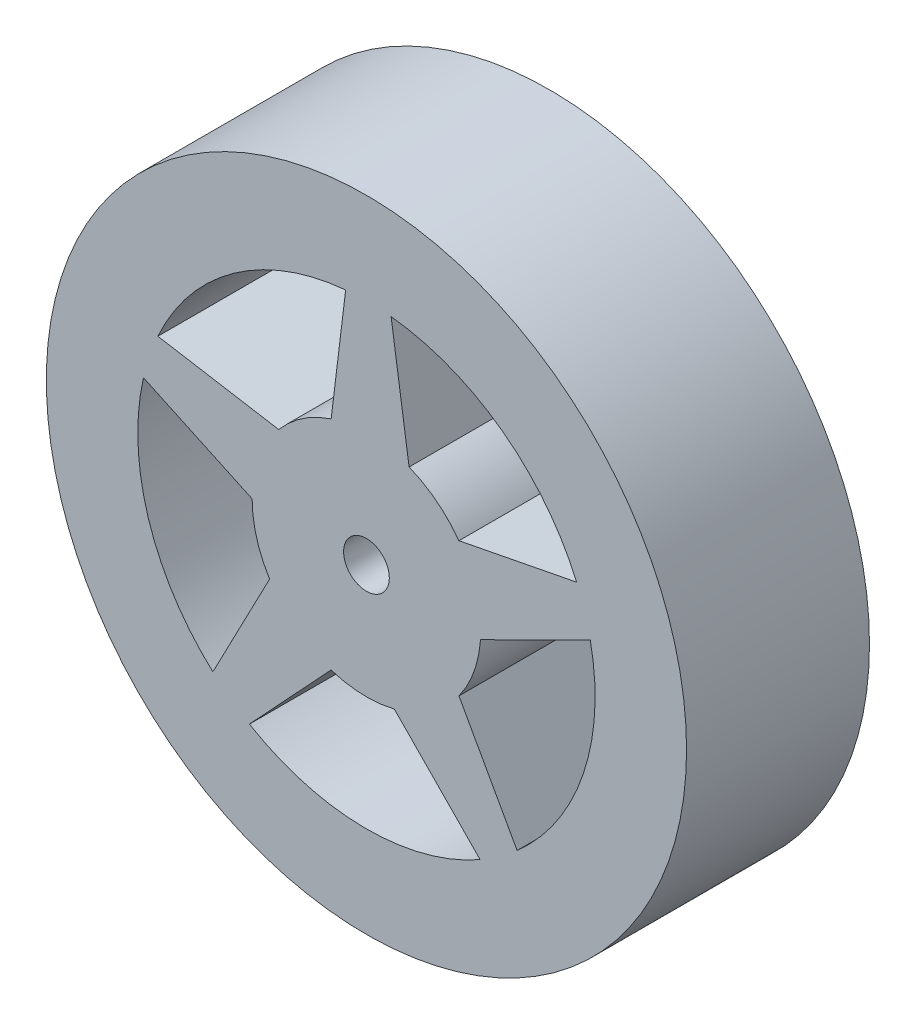
ISO-10303-21;
HEADER;
FILE_DESCRIPTION(('STEP AP214'),'2;1');
FILE_NAME('part.step','',(''),(''),'','','');
FILE_SCHEMA(('AUTOMOTIVE_DESIGN { 1 0 10303 214 1 1 1 1 }'));
ENDSEC;
DATA;
#1=APPLICATION_CONTEXT('core data for automotive mechanical design processes');
#2=APPLICATION_PROTOCOL_DEFINITION('international standard','automotive_design',2000,#1);
#3=PRODUCT_CONTEXT('',#1,'mechanical');
#4=PRODUCT('Part','Part','',(#3));
#5=PRODUCT_RELATED_PRODUCT_CATEGORY('part','',(#4));
#6=PRODUCT_DEFINITION_FORMATION('','',#4);
#7=PRODUCT_DEFINITION_CONTEXT('part definition',#1,'design');
#8=PRODUCT_DEFINITION('design','',#6,#7);
#9=PRODUCT_DEFINITION_SHAPE('','',#8);
#10=(LENGTH_UNIT() NAMED_UNIT(*) SI_UNIT(.MILLI.,.METRE.));
#11=(NAMED_UNIT(*) PLANE_ANGLE_UNIT() SI_UNIT($,.RADIAN.));
#12=(NAMED_UNIT(*) SI_UNIT($,.STERADIAN.) SOLID_ANGLE_UNIT());
#13=UNCERTAINTY_MEASURE_WITH_UNIT(LENGTH_MEASURE(1.E-05),#10,'distance_accuracy_value','');
#14=(GEOMETRIC_REPRESENTATION_CONTEXT(3) GLOBAL_UNCERTAINTY_ASSIGNED_CONTEXT((#13)) GLOBAL_UNIT_ASSIGNED_CONTEXT((#10,
#11,#12)) REPRESENTATION_CONTEXT('',''));
#15=CARTESIAN_POINT('',(0.,0.,0.));
#16=DIRECTION('',(0.,0.,1.));
#17=DIRECTION('',(1.,0.,0.));
#18=AXIS2_PLACEMENT_3D('',#15,#16,#17);
#19=CARTESIAN_POINT('',(0.,0.,10.));
#20=DIRECTION('',(0.,0.,-1.));
#21=DIRECTION('',(-1.,0.,0.));
#22=AXIS2_PLACEMENT_3D('',#19,#20,#21);
#23=CYLINDRICAL_SURFACE('',#22,25.);
#24=DIRECTION('',(0.,0.,-1.));
#25=VECTOR('',#24,1.);
#26=CARTESIAN_POINT('',(24.4708623778841,5.11633604082602,10.));
#27=LINE('',#26,#25);
#28=CARTESIAN_POINT('',(24.4708623778841,5.11633604082602,-10.));
#29=VERTEX_POINT('',#28);
#30=CARTESIAN_POINT('',(24.4708623778841,5.11633604082602,10.));
#31=VERTEX_POINT('',#30);
#32=EDGE_CURVE('E218',#29,#31,#27,.F.);
#33=ORIENTED_EDGE('',*,*,#32,.F.);
#34=CARTESIAN_POINT('',(0.,0.,-10.));
#35=DIRECTION('',(0.,0.,1.));
#36=DIRECTION('',(1.,0.,0.));
#37=AXIS2_PLACEMENT_3D('',#34,#35,#36);
#38=CIRCLE('',#37,25.);
#39=CARTESIAN_POINT('',(16.4712049980899,-18.8068978279486,-10.));
#40=VERTEX_POINT('',#39);
#41=EDGE_CURVE('E339',#40,#29,#38,.T.);
#42=ORIENTED_EDGE('',*,*,#41,.F.);
#43=DIRECTION('',(0.,0.,-1.));
#44=VECTOR('',#43,1.);
#45=CARTESIAN_POINT('',(16.4712049980899,-18.8068978279486,10.));
#46=LINE('',#45,#44);
#47=CARTESIAN_POINT('',(16.4712049980899,-18.8068978279486,10.));
#48=VERTEX_POINT('',#47);
#49=EDGE_CURVE('E56',#48,#40,#46,.T.);
#50=ORIENTED_EDGE('',*,*,#49,.F.);
#51=CARTESIAN_POINT('',(0.,0.,10.));
#52=DIRECTION('',(0.,0.,1.));
#53=DIRECTION('',(1.,0.,0.));
#54=AXIS2_PLACEMENT_3D('',#51,#52,#53);
#55=CIRCLE('',#54,25.);
#56=EDGE_CURVE('E348',#48,#31,#55,.T.);
#57=ORIENTED_EDGE('',*,*,#56,.T.);
#58=EDGE_LOOP('',(#33,#42,#50,#57));
#59=FACE_BOUND('',#58,.T.);
#60=ADVANCED_FACE('F41',(#59),#23,.F.);
#61=DIRECTION('',(0.,0.,-1.));
#62=VECTOR('',#61,1.);
#63=CARTESIAN_POINT('',(-12.7965404683244,-21.4766978849761,10.));
#64=LINE('',#63,#62);
#65=CARTESIAN_POINT('',(-12.7965404683244,-21.4766978849761,10.));
#66=VERTEX_POINT('',#65);
#67=CARTESIAN_POINT('',(-12.7965404683244,-21.4766978849761,-10.));
#68=VERTEX_POINT('',#67);
#69=EDGE_CURVE('E229',#66,#68,#64,.T.);
#70=ORIENTED_EDGE('',*,*,#69,.F.);
#71=CARTESIAN_POINT('',(12.42783707296,-21.6921383383004,10.));
#72=VERTEX_POINT('',#71);
#73=EDGE_CURVE('E64',#66,#72,#55,.T.);
#74=ORIENTED_EDGE('',*,*,#73,.T.);
#75=DIRECTION('',(0.,0.,-1.));
#76=VECTOR('',#75,1.);
#77=CARTESIAN_POINT('',(12.42783707296,-21.6921383383004,10.));
#78=LINE('',#77,#76);
#79=CARTESIAN_POINT('',(12.42783707296,-21.6921383383004,-10.));
#80=VERTEX_POINT('',#79);
#81=EDGE_CURVE('E268',#80,#72,#78,.F.);
#82=ORIENTED_EDGE('',*,*,#81,.F.);
#83=EDGE_CURVE('E289',#68,#80,#38,.T.);
#84=ORIENTED_EDGE('',*,*,#83,.F.);
#85=EDGE_LOOP('',(#70,#74,#82,#84));
#86=FACE_BOUND('',#85,.T.);
#87=ADVANCED_FACE('F405',(#86),#23,.F.);
#88=DIRECTION('',(0.,0.,-1.));
#89=VECTOR('',#88,1.);
#90=CARTESIAN_POINT('',(-16.7900366601489,-18.5228148225602,10.));
#91=LINE('',#90,#89);
#92=CARTESIAN_POINT('',(-16.7900366601489,-18.5228148225602,-10.));
#93=VERTEX_POINT('',#92);
#94=CARTESIAN_POINT('',(-16.7900366601489,-18.5228148225602,10.));
#95=VERTEX_POINT('',#94);
#96=EDGE_CURVE('E271',#93,#95,#91,.F.);
#97=ORIENTED_EDGE('',*,*,#96,.F.);
#98=CARTESIAN_POINT('',(-24.3799019459278,5.53356856892053,-10.));
#99=VERTEX_POINT('',#98);
#100=EDGE_CURVE('E257',#99,#93,#38,.T.);
#101=ORIENTED_EDGE('',*,*,#100,.F.);
#102=DIRECTION('',(0.,0.,-1.));
#103=VECTOR('',#102,1.);
#104=CARTESIAN_POINT('',(-24.3799019459278,5.53356856892053,10.));
#105=LINE('',#104,#103);
#106=CARTESIAN_POINT('',(-24.3799019459278,5.53356856892053,10.));
#107=VERTEX_POINT('',#106);
#108=EDGE_CURVE('E267',#107,#99,#105,.T.);
#109=ORIENTED_EDGE('',*,*,#108,.F.);
#110=EDGE_CURVE('E254',#107,#95,#55,.T.);
#111=ORIENTED_EDGE('',*,*,#110,.T.);
#112=EDGE_LOOP('',(#97,#101,#109,#111));
#113=FACE_BOUND('',#112,.T.);
#114=ADVANCED_FACE('F386',(#113),#23,.F.);
#115=DIRECTION('',(0.,0.,-1.));
#116=VECTOR('',#115,1.);
#117=CARTESIAN_POINT('',(-22.8046504012887,10.2444092106379,10.));
#118=LINE('',#117,#116);
#119=CARTESIAN_POINT('',(-22.8046504012887,10.2444092106379,-10.));
#120=VERTEX_POINT('',#119);
#121=CARTESIAN_POINT('',(-22.8046504012887,10.2444092106379,10.));
#122=VERTEX_POINT('',#121);
#123=EDGE_CURVE('E266',#120,#122,#118,.F.);
#124=ORIENTED_EDGE('',*,*,#123,.F.);
#125=CARTESIAN_POINT('',(-2.27106757664891,24.896631339647,-10.));
#126=VERTEX_POINT('',#125);
#127=EDGE_CURVE('E188',#126,#120,#38,.T.);
#128=ORIENTED_EDGE('',*,*,#127,.F.);
#129=DIRECTION('',(0.,0.,-1.));
#130=VECTOR('',#129,1.);
#131=CARTESIAN_POINT('',(-2.27106757664891,24.896631339647,10.));
#132=LINE('',#131,#130);
#133=CARTESIAN_POINT('',(-2.27106757664891,24.896631339647,10.));
#134=VERTEX_POINT('',#133);
#135=EDGE_CURVE('E49',#134,#126,#132,.T.);
#136=ORIENTED_EDGE('',*,*,#135,.F.);
#137=EDGE_CURVE('E251',#134,#122,#55,.T.);
#138=ORIENTED_EDGE('',*,*,#137,.T.);
#139=EDGE_LOOP('',(#124,#128,#136,#138));
#140=FACE_BOUND('',#139,.T.);
#141=ADVANCED_FACE('F265',(#140),#23,.F.);
#142=CARTESIAN_POINT('',(0.,0.,10.));
#143=DIRECTION('',(0.,0.,-1.));
#144=DIRECTION('',(-1.,0.,0.));
#145=AXIS2_PLACEMENT_3D('',#142,#143,#144);
#146=CYLINDRICAL_SURFACE('',#145,12.5);
#147=CARTESIAN_POINT('',(0.,0.,-10.));
#148=DIRECTION('',(0.,0.,1.));
#149=DIRECTION('',(1.,0.,0.));
#150=AXIS2_PLACEMENT_3D('',#147,#148,#149);
#151=CIRCLE('',#150,12.5);
#152=CARTESIAN_POINT('',(10.1106359392021,-7.35017284864209,-10.));
#153=VERTEX_POINT('',#152);
#154=CARTESIAN_POINT('',(12.4710442423428,-0.850326705171322,-10.));
#155=VERTEX_POINT('',#154);
#156=EDGE_CURVE('E217',#153,#155,#151,.T.);
#157=ORIENTED_EDGE('',*,*,#156,.T.);
#158=DIRECTION('',(0.,0.,-1.));
#159=VECTOR('',#158,1.);
#160=CARTESIAN_POINT('',(12.4710442423428,-0.85032670517132,10.));
#161=LINE('',#160,#159);
#162=CARTESIAN_POINT('',(12.4710442423428,-0.850326705171322,10.));
#163=VERTEX_POINT('',#162);
#164=EDGE_CURVE('E330',#163,#155,#161,.T.);
#165=ORIENTED_EDGE('',*,*,#164,.F.);
#166=CARTESIAN_POINT('',(0.,0.,10.));
#167=DIRECTION('',(0.,0.,1.));
#168=DIRECTION('',(1.,0.,0.));
#169=AXIS2_PLACEMENT_3D('',#166,#167,#168);
#170=CIRCLE('',#169,12.5);
#171=CARTESIAN_POINT('',(10.1106359392021,-7.35017284864209,10.));
#172=VERTEX_POINT('',#171);
#173=EDGE_CURVE('E344',#172,#163,#170,.T.);
#174=ORIENTED_EDGE('',*,*,#173,.F.);
#175=DIRECTION('',(0.,0.,-1.));
#176=VECTOR('',#175,1.);
#177=CARTESIAN_POINT('',(10.1106359392021,-7.35017284864209,10.));
#178=LINE('',#177,#176);
#179=EDGE_CURVE('E310',#172,#153,#178,.T.);
#180=ORIENTED_EDGE('',*,*,#179,.T.);
#181=EDGE_LOOP('',(#157,#165,#174,#180));
#182=FACE_BOUND('',#181,.T.);
#183=ADVANCED_FACE('F341',(#182),#146,.T.);
#184=CARTESIAN_POINT('',(-3.86607145444526,-11.8871145156898,10.));
#185=VERTEX_POINT('',#184);
#186=CARTESIAN_POINT('',(3.04505585455277,-12.1234332943541,10.));
#187=VERTEX_POINT('',#186);
#188=EDGE_CURVE('E363',#185,#187,#170,.T.);
#189=ORIENTED_EDGE('',*,*,#188,.F.);
#190=DIRECTION('',(0.,0.,-1.));
#191=VECTOR('',#190,1.);
#192=CARTESIAN_POINT('',(-3.86607145444526,-11.8871145156898,10.));
#193=LINE('',#192,#191);
#194=CARTESIAN_POINT('',(-3.86607145444526,-11.8871145156898,-10.));
#195=VERTEX_POINT('',#194);
#196=EDGE_CURVE('E298',#185,#195,#193,.T.);
#197=ORIENTED_EDGE('',*,*,#196,.T.);
#198=CARTESIAN_POINT('',(3.04505585455277,-12.1234332943541,-10.));
#199=VERTEX_POINT('',#198);
#200=EDGE_CURVE('E215',#195,#199,#151,.T.);
#201=ORIENTED_EDGE('',*,*,#200,.T.);
#202=DIRECTION('',(0.,0.,-1.));
#203=VECTOR('',#202,1.);
#204=CARTESIAN_POINT('',(3.04505585455277,-12.1234332943541,10.));
#205=LINE('',#204,#203);
#206=EDGE_CURVE('E316',#187,#199,#205,.T.);
#207=ORIENTED_EDGE('',*,*,#206,.F.);
#208=EDGE_LOOP('',(#189,#197,#201,#207));
#209=FACE_BOUND('',#208,.T.);
#210=ADVANCED_FACE('F402',(#209),#146,.T.);
#211=CARTESIAN_POINT('',(-12.499999500985,0.00353204978360225,-10.));
#212=VERTEX_POINT('',#211);
#213=CARTESIAN_POINT('',(-10.5890962265874,-6.64236713108156,-10.));
#214=VERTEX_POINT('',#213);
#215=EDGE_CURVE('E208',#212,#214,#151,.T.);
#216=ORIENTED_EDGE('',*,*,#215,.T.);
#217=DIRECTION('',(0.,0.,-1.));
#218=VECTOR('',#217,1.);
#219=CARTESIAN_POINT('',(-10.5890962265874,-6.64236713108157,10.));
#220=LINE('',#219,#218);
#221=CARTESIAN_POINT('',(-10.5890962265874,-6.64236713108156,10.));
#222=VERTEX_POINT('',#221);
#223=EDGE_CURVE('E300',#222,#214,#220,.T.);
#224=ORIENTED_EDGE('',*,*,#223,.F.);
#225=CARTESIAN_POINT('',(-12.499999500985,0.00353204978360052,10.));
#226=VERTEX_POINT('',#225);
#227=EDGE_CURVE('E236',#226,#222,#170,.T.);
#228=ORIENTED_EDGE('',*,*,#227,.F.);
#229=DIRECTION('',(0.,0.,-1.));
#230=VECTOR('',#229,1.);
#231=CARTESIAN_POINT('',(-12.499999500985,0.00353204978360225,10.));
#232=LINE('',#231,#230);
#233=EDGE_CURVE('E203',#226,#212,#232,.T.);
#234=ORIENTED_EDGE('',*,*,#233,.T.);
#235=EDGE_LOOP('',(#216,#224,#228,#234));
#236=FACE_BOUND('',#235,.T.);
#237=ADVANCED_FACE('F379',(#236),#146,.T.);
#238=CARTESIAN_POINT('',(-3.85935309652028,11.889297442506,-10.));
#239=VERTEX_POINT('',#238);
#240=CARTESIAN_POINT('',(-9.58947723272698,8.01822464159062,-10.));
#241=VERTEX_POINT('',#240);
#242=EDGE_CURVE('E185',#239,#241,#151,.T.);
#243=ORIENTED_EDGE('',*,*,#242,.T.);
#244=DIRECTION('',(0.,0.,-1.));
#245=VECTOR('',#244,1.);
#246=CARTESIAN_POINT('',(-9.58947723272698,8.01822464159062,10.));
#247=LINE('',#246,#245);
#248=CARTESIAN_POINT('',(-9.58947723272698,8.01822464159062,10.));
#249=VERTEX_POINT('',#248);
#250=EDGE_CURVE('E195',#249,#241,#247,.T.);
#251=ORIENTED_EDGE('',*,*,#250,.F.);
#252=CARTESIAN_POINT('',(-3.85935309652028,11.889297442506,10.));
#253=VERTEX_POINT('',#252);
#254=EDGE_CURVE('E233',#253,#249,#170,.T.);
#255=ORIENTED_EDGE('',*,*,#254,.F.);
#256=DIRECTION('',(0.,0.,-1.));
#257=VECTOR('',#256,1.);
#258=CARTESIAN_POINT('',(-3.85935309652028,11.889297442506,10.));
#259=LINE('',#258,#257);
#260=EDGE_CURVE('E206',#253,#239,#259,.T.);
#261=ORIENTED_EDGE('',*,*,#260,.T.);
#262=EDGE_LOOP('',(#243,#251,#255,#261));
#263=FACE_BOUND('',#262,.T.);
#264=ADVANCED_FACE('F205',(#263),#146,.T.);
#265=CARTESIAN_POINT('',(0.,0.,10.));
#266=DIRECTION('',(0.,0.,1.));
#267=DIRECTION('',(1.,0.,0.));
#268=AXIS2_PLACEMENT_3D('',#265,#266,#267);
#269=PLANE('',#268);
#270=CARTESIAN_POINT('',(0.,0.,10.));
#271=DIRECTION('',(0.,0.,1.));
#272=DIRECTION('',(1.,0.,0.));
#273=AXIS2_PLACEMENT_3D('',#270,#271,#272);
#274=CIRCLE('',#273,2.5);
#275=CARTESIAN_POINT('',(2.5,0.,10.));
#276=VERTEX_POINT('',#275);
#277=EDGE_CURVE('E421',#276,#276,#274,.T.);
#278=ORIENTED_EDGE('',*,*,#277,.F.);
#279=EDGE_LOOP('',(#278));
#280=FACE_BOUND('',#279,.T.);
#281=CARTESIAN_POINT('',(10.1147881127483,7.34445787204241,10.));
#282=VERTEX_POINT('',#281);
#283=CARTESIAN_POINT('',(4.66247336241872,11.5979024890165,10.));
#284=VERTEX_POINT('',#283);
#285=EDGE_CURVE('E237',#282,#284,#170,.T.);
#286=ORIENTED_EDGE('',*,*,#285,.T.);
#287=DIRECTION('',(0.146737673225105,-0.989175442101391,0.));
#288=VECTOR('',#287,1.);
#289=CARTESIAN_POINT('',(6.24550870366448,0.92648015334466,10.));
#290=LINE('',#289,#288);
#291=CARTESIAN_POINT('',(2.69598761059333,24.8542079093969,10.));
#292=VERTEX_POINT('',#291);
#293=EDGE_CURVE('E235',#292,#284,#290,.T.);
#294=ORIENTED_EDGE('',*,*,#293,.F.);
#295=CARTESIAN_POINT('',(22.976304992811,9.85339580435737,10.));
#296=VERTEX_POINT('',#295);
#297=EDGE_CURVE('E255',#296,#292,#55,.T.);
#298=ORIENTED_EDGE('',*,*,#297,.F.);
#299=DIRECTION('',(0.981499575248451,0.191464314657094,0.));
#300=VECTOR('',#299,1.);
#301=CARTESIAN_POINT('',(-1.00939245872167,5.17442778446024,10.));
#302=LINE('',#301,#300);
#303=EDGE_CURVE('E322',#282,#296,#302,.T.);
#304=ORIENTED_EDGE('',*,*,#303,.F.);
#305=EDGE_LOOP('',(#286,#294,#298,#304));
#306=FACE_BOUND('',#305,.T.);
#307=DIRECTION('',(0.121206664630946,0.992627293826359,0.));
#308=VECTOR('',#307,1.);
#309=CARTESIAN_POINT('',(-5.23309268624852,0.638996846197679,10.));
#310=LINE('',#309,#308);
#311=EDGE_CURVE('E239',#253,#134,#310,.T.);
#312=ORIENTED_EDGE('',*,*,#311,.F.);
#313=ORIENTED_EDGE('',*,*,#254,.T.);
#314=DIRECTION('',(0.986106184711261,-0.166116201720968,0.));
#315=VECTOR('',#314,1.);
#316=CARTESIAN_POINT('',(1.04883334089247,6.2261298625328,10.));
#317=LINE('',#316,#315);
#318=EDGE_CURVE('E198',#122,#249,#317,.T.);
#319=ORIENTED_EDGE('',*,*,#318,.F.);
#320=ORIENTED_EDGE('',*,*,#137,.F.);
#321=EDGE_LOOP('',(#312,#313,#319,#320));
#322=FACE_BOUND('',#321,.T.);
#323=ORIENTED_EDGE('',*,*,#73,.F.);
#324=DIRECTION('',(-0.681509935852068,-0.731808859836303,0.));
#325=VECTOR('',#324,1.);
#326=CARTESIAN_POINT('',(3.85806799385786,-3.59289401278243,10.));
#327=LINE('',#326,#325);
#328=EDGE_CURVE('E285',#185,#66,#327,.T.);
#329=ORIENTED_EDGE('',*,*,#328,.F.);
#330=ORIENTED_EDGE('',*,*,#188,.T.);
#331=DIRECTION('',(-0.700136008151229,0.714009502800952,0.));
#332=VECTOR('',#331,1.);
#333=CARTESIAN_POINT('',(-4.50815130910358,-4.42055609808518,10.));
#334=LINE('',#333,#332);
#335=EDGE_CURVE('E304',#72,#187,#334,.T.);
#336=ORIENTED_EDGE('',*,*,#335,.F.);
#337=EDGE_LOOP('',(#323,#329,#330,#336));
#338=FACE_BOUND('',#337,.T.);
#339=ORIENTED_EDGE('',*,*,#110,.F.);
#340=DIRECTION('',(-0.906589736843511,0.422013091088432,0.));
#341=VECTOR('',#340,1.);
#342=CARTESIAN_POINT('',(-2.22483668765845,-4.77950601480606,10.));
#343=LINE('',#342,#341);
#344=EDGE_CURVE('E375',#226,#107,#343,.T.);
#345=ORIENTED_EDGE('',*,*,#344,.F.);
#346=ORIENTED_EDGE('',*,*,#227,.T.);
#347=DIRECTION('',(0.462709465442945,0.886509983355802,0.));
#348=VECTOR('',#347,1.);
#349=CARTESIAN_POINT('',(-5.59729405045885,2.92147972007138,10.));
#350=LINE('',#349,#348);
#351=EDGE_CURVE('E292',#95,#222,#350,.T.);
#352=ORIENTED_EDGE('',*,*,#351,.F.);
#353=EDGE_LOOP('',(#339,#345,#346,#352));
#354=FACE_BOUND('',#353,.T.);
#355=DIRECTION('',(-0.895417315228074,-0.445227842334404,0.));
#356=VECTOR('',#355,1.);
#357=CARTESIAN_POINT('',(2.81110331500553,-5.6535336378636,10.));
#358=LINE('',#357,#356);
#359=EDGE_CURVE('E320',#31,#163,#358,.T.);
#360=ORIENTED_EDGE('',*,*,#359,.F.);
#361=ORIENTED_EDGE('',*,*,#56,.F.);
#362=DIRECTION('',(0.485393432816176,-0.874295839735572,0.));
#363=VECTOR('',#362,1.);
#364=CARTESIAN_POINT('',(4.60925383877071,2.55897539693054,10.));
#365=LINE('',#364,#363);
#366=EDGE_CURVE('E306',#172,#48,#365,.T.);
#367=ORIENTED_EDGE('',*,*,#366,.F.);
#368=ORIENTED_EDGE('',*,*,#173,.T.);
#369=EDGE_LOOP('',(#360,#361,#367,#368));
#370=FACE_BOUND('',#369,.T.);
#371=CARTESIAN_POINT('',(0.,0.,10.));
#372=DIRECTION('',(0.,0.,1.));
#373=DIRECTION('',(1.,0.,0.));
#374=AXIS2_PLACEMENT_3D('',#371,#372,#373);
#375=CIRCLE('',#374,35.);
#376=CARTESIAN_POINT('',(35.,0.,10.));
#377=VERTEX_POINT('',#376);
#378=EDGE_CURVE('E258',#377,#377,#375,.T.);
#379=ORIENTED_EDGE('',*,*,#378,.T.);
#380=EDGE_LOOP('',(#379));
#381=FACE_BOUND('',#380,.T.);
#382=ADVANCED_FACE('F346',(#280,#306,#322,#338,#354,#370,#381),#269,.T.);
#383=CARTESIAN_POINT('',(0.,0.,-10.));
#384=DIRECTION('',(0.,0.,1.));
#385=DIRECTION('',(1.,0.,0.));
#386=AXIS2_PLACEMENT_3D('',#383,#384,#385);
#387=PLANE('',#386);
#388=CARTESIAN_POINT('',(0.,0.,-10.));
#389=DIRECTION('',(0.,0.,1.));
#390=DIRECTION('',(1.,0.,0.));
#391=AXIS2_PLACEMENT_3D('',#388,#389,#390);
#392=CIRCLE('',#391,2.5);
#393=CARTESIAN_POINT('',(2.5,0.,-10.));
#394=VERTEX_POINT('',#393);
#395=EDGE_CURVE('E192',#394,#394,#392,.T.);
#396=ORIENTED_EDGE('',*,*,#395,.T.);
#397=EDGE_LOOP('',(#396));
#398=FACE_BOUND('',#397,.T.);
#399=DIRECTION('',(0.146737673225105,-0.989175442101391,0.));
#400=VECTOR('',#399,1.);
#401=CARTESIAN_POINT('',(6.24550870366448,0.92648015334466,-10.));
#402=LINE('',#401,#400);
#403=CARTESIAN_POINT('',(2.69598761059333,24.8542079093969,-10.));
#404=VERTEX_POINT('',#403);
#405=CARTESIAN_POINT('',(4.66247336241872,11.5979024890165,-10.));
#406=VERTEX_POINT('',#405);
#407=EDGE_CURVE('E207',#404,#406,#402,.T.);
#408=ORIENTED_EDGE('',*,*,#407,.T.);
#409=CARTESIAN_POINT('',(10.1147881127483,7.34445787204241,-10.));
#410=VERTEX_POINT('',#409);
#411=EDGE_CURVE('E210',#410,#406,#151,.T.);
#412=ORIENTED_EDGE('',*,*,#411,.F.);
#413=DIRECTION('',(0.981499575248451,0.191464314657094,0.));
#414=VECTOR('',#413,1.);
#415=CARTESIAN_POINT('',(-1.00939245872167,5.17442778446024,-10.));
#416=LINE('',#415,#414);
#417=CARTESIAN_POINT('',(22.976304992811,9.85339580435736,-10.));
#418=VERTEX_POINT('',#417);
#419=EDGE_CURVE('E323',#410,#418,#416,.T.);
#420=ORIENTED_EDGE('',*,*,#419,.T.);
#421=EDGE_CURVE('E247',#418,#404,#38,.T.);
#422=ORIENTED_EDGE('',*,*,#421,.T.);
#423=EDGE_LOOP('',(#408,#412,#420,#422));
#424=FACE_BOUND('',#423,.T.);
#425=ORIENTED_EDGE('',*,*,#242,.F.);
#426=DIRECTION('',(0.121206664630946,0.992627293826359,0.));
#427=VECTOR('',#426,1.);
#428=CARTESIAN_POINT('',(-5.23309268624852,0.638996846197679,-10.));
#429=LINE('',#428,#427);
#430=EDGE_CURVE('E212',#239,#126,#429,.T.);
#431=ORIENTED_EDGE('',*,*,#430,.T.);
#432=ORIENTED_EDGE('',*,*,#127,.T.);
#433=DIRECTION('',(0.986106184711261,-0.166116201720968,0.));
#434=VECTOR('',#433,1.);
#435=CARTESIAN_POINT('',(1.04883334089247,6.2261298625328,-10.));
#436=LINE('',#435,#434);
#437=EDGE_CURVE('E180',#120,#241,#436,.T.);
#438=ORIENTED_EDGE('',*,*,#437,.T.);
#439=EDGE_LOOP('',(#425,#431,#432,#438));
#440=FACE_BOUND('',#439,.T.);
#441=DIRECTION('',(-0.681509935852068,-0.731808859836303,0.));
#442=VECTOR('',#441,1.);
#443=CARTESIAN_POINT('',(3.85806799385786,-3.59289401278243,-10.));
#444=LINE('',#443,#442);
#445=EDGE_CURVE('E282',#195,#68,#444,.T.);
#446=ORIENTED_EDGE('',*,*,#445,.T.);
#447=ORIENTED_EDGE('',*,*,#83,.T.);
#448=DIRECTION('',(-0.700136008151229,0.714009502800952,0.));
#449=VECTOR('',#448,1.);
#450=CARTESIAN_POINT('',(-4.50815130910358,-4.42055609808518,-10.));
#451=LINE('',#450,#449);
#452=EDGE_CURVE('E303',#80,#199,#451,.T.);
#453=ORIENTED_EDGE('',*,*,#452,.T.);
#454=ORIENTED_EDGE('',*,*,#200,.F.);
#455=EDGE_LOOP('',(#446,#447,#453,#454));
#456=FACE_BOUND('',#455,.T.);
#457=DIRECTION('',(-0.906589736843511,0.422013091088432,0.));
#458=VECTOR('',#457,1.);
#459=CARTESIAN_POINT('',(-2.22483668765845,-4.77950601480606,-10.));
#460=LINE('',#459,#458);
#461=EDGE_CURVE('E191',#212,#99,#460,.T.);
#462=ORIENTED_EDGE('',*,*,#461,.T.);
#463=ORIENTED_EDGE('',*,*,#100,.T.);
#464=DIRECTION('',(0.462709465442945,0.886509983355802,0.));
#465=VECTOR('',#464,1.);
#466=CARTESIAN_POINT('',(-5.59729405045885,2.92147972007138,-10.));
#467=LINE('',#466,#465);
#468=EDGE_CURVE('E202',#93,#214,#467,.T.);
#469=ORIENTED_EDGE('',*,*,#468,.T.);
#470=ORIENTED_EDGE('',*,*,#215,.F.);
#471=EDGE_LOOP('',(#462,#463,#469,#470));
#472=FACE_BOUND('',#471,.T.);
#473=ORIENTED_EDGE('',*,*,#41,.T.);
#474=DIRECTION('',(-0.895417315228074,-0.445227842334404,0.));
#475=VECTOR('',#474,1.);
#476=CARTESIAN_POINT('',(2.81110331500553,-5.6535336378636,-10.));
#477=LINE('',#476,#475);
#478=EDGE_CURVE('E319',#29,#155,#477,.T.);
#479=ORIENTED_EDGE('',*,*,#478,.T.);
#480=ORIENTED_EDGE('',*,*,#156,.F.);
#481=DIRECTION('',(0.485393432816176,-0.874295839735572,0.));
#482=VECTOR('',#481,1.);
#483=CARTESIAN_POINT('',(4.60925383877071,2.55897539693054,-10.));
#484=LINE('',#483,#482);
#485=EDGE_CURVE('E307',#153,#40,#484,.T.);
#486=ORIENTED_EDGE('',*,*,#485,.T.);
#487=EDGE_LOOP('',(#473,#479,#480,#486));
#488=FACE_BOUND('',#487,.T.);
#489=CARTESIAN_POINT('',(0.,0.,-10.));
#490=DIRECTION('',(0.,0.,1.));
#491=DIRECTION('',(1.,0.,0.));
#492=AXIS2_PLACEMENT_3D('',#489,#490,#491);
#493=CIRCLE('',#492,35.);
#494=CARTESIAN_POINT('',(35.,0.,-10.));
#495=VERTEX_POINT('',#494);
#496=EDGE_CURVE('E253',#495,#495,#493,.T.);
#497=ORIENTED_EDGE('',*,*,#496,.F.);
#498=EDGE_LOOP('',(#497));
#499=FACE_BOUND('',#498,.T.);
#500=ADVANCED_FACE('F182',(#398,#424,#440,#456,#472,#488,#499),#387,.F.);
#501=CARTESIAN_POINT('',(0.,0.,10.));
#502=DIRECTION('',(0.,0.,-1.));
#503=DIRECTION('',(-1.,0.,0.));
#504=AXIS2_PLACEMENT_3D('',#501,#502,#503);
#505=CYLINDRICAL_SURFACE('',#504,35.);
#506=ORIENTED_EDGE('',*,*,#378,.F.);
#507=EDGE_LOOP('',(#506));
#508=FACE_BOUND('',#507,.T.);
#509=ORIENTED_EDGE('',*,*,#496,.T.);
#510=EDGE_LOOP('',(#509));
#511=FACE_BOUND('',#510,.T.);
#512=ADVANCED_FACE('F43',(#508,#511),#505,.T.);
#513=DIRECTION('',(0.,0.,-1.));
#514=VECTOR('',#513,1.);
#515=CARTESIAN_POINT('',(22.976304992811,9.85339580435736,10.));
#516=LINE('',#515,#514);
#517=EDGE_CURVE('E222',#296,#418,#516,.T.);
#518=ORIENTED_EDGE('',*,*,#517,.F.);
#519=ORIENTED_EDGE('',*,*,#297,.T.);
#520=DIRECTION('',(0.,0.,-1.));
#521=VECTOR('',#520,1.);
#522=CARTESIAN_POINT('',(2.69598761059333,24.8542079093969,10.));
#523=LINE('',#522,#521);
#524=EDGE_CURVE('E11',#404,#292,#523,.F.);
#525=ORIENTED_EDGE('',*,*,#524,.F.);
#526=ORIENTED_EDGE('',*,*,#421,.F.);
#527=EDGE_LOOP('',(#518,#519,#525,#526));
#528=FACE_BOUND('',#527,.T.);
#529=ADVANCED_FACE('F353',(#528),#23,.F.);
#530=ORIENTED_EDGE('',*,*,#285,.F.);
#531=DIRECTION('',(0.,0.,-1.));
#532=VECTOR('',#531,1.);
#533=CARTESIAN_POINT('',(10.1147881127483,7.34445787204241,10.));
#534=LINE('',#533,#532);
#535=EDGE_CURVE('E325',#282,#410,#534,.T.);
#536=ORIENTED_EDGE('',*,*,#535,.T.);
#537=ORIENTED_EDGE('',*,*,#411,.T.);
#538=DIRECTION('',(0.,0.,-1.));
#539=VECTOR('',#538,1.);
#540=CARTESIAN_POINT('',(4.66247336241872,11.5979024890165,10.));
#541=LINE('',#540,#539);
#542=EDGE_CURVE('E244',#284,#406,#541,.T.);
#543=ORIENTED_EDGE('',*,*,#542,.F.);
#544=EDGE_LOOP('',(#530,#536,#537,#543));
#545=FACE_BOUND('',#544,.T.);
#546=ADVANCED_FACE('F392',(#545),#146,.T.);
#547=CARTESIAN_POINT('',(6.24550870366448,0.92648015334466,10.));
#548=DIRECTION('',(0.989175442101391,0.146737673225105,0.));
#549=DIRECTION('',(-0.146737673225105,0.989175442101391,0.));
#550=AXIS2_PLACEMENT_3D('',#547,#548,#549);
#551=PLANE('',#550);
#552=ORIENTED_EDGE('',*,*,#407,.F.);
#553=ORIENTED_EDGE('',*,*,#524,.T.);
#554=ORIENTED_EDGE('',*,*,#293,.T.);
#555=ORIENTED_EDGE('',*,*,#542,.T.);
#556=EDGE_LOOP('',(#552,#553,#554,#555));
#557=FACE_BOUND('',#556,.T.);
#558=ADVANCED_FACE('F360',(#557),#551,.T.);
#559=CARTESIAN_POINT('',(-5.23309268624852,0.638996846197679,10.));
#560=DIRECTION('',(-0.992627293826359,0.121206664630946,0.));
#561=DIRECTION('',(-0.121206664630946,-0.992627293826359,0.));
#562=AXIS2_PLACEMENT_3D('',#559,#560,#561);
#563=PLANE('',#562);
#564=ORIENTED_EDGE('',*,*,#311,.T.);
#565=ORIENTED_EDGE('',*,*,#135,.T.);
#566=ORIENTED_EDGE('',*,*,#430,.F.);
#567=ORIENTED_EDGE('',*,*,#260,.F.);
#568=EDGE_LOOP('',(#564,#565,#566,#567));
#569=FACE_BOUND('',#568,.T.);
#570=ADVANCED_FACE('F262',(#569),#563,.T.);
#571=CARTESIAN_POINT('',(4.60925383877071,2.55897539693054,10.));
#572=DIRECTION('',(0.874295839735572,0.485393432816176,0.));
#573=DIRECTION('',(-0.485393432816176,0.874295839735571,0.));
#574=AXIS2_PLACEMENT_3D('',#571,#572,#573);
#575=PLANE('',#574);
#576=ORIENTED_EDGE('',*,*,#366,.T.);
#577=ORIENTED_EDGE('',*,*,#49,.T.);
#578=ORIENTED_EDGE('',*,*,#485,.F.);
#579=ORIENTED_EDGE('',*,*,#179,.F.);
#580=EDGE_LOOP('',(#576,#577,#578,#579));
#581=FACE_BOUND('',#580,.T.);
#582=ADVANCED_FACE('F333',(#581),#575,.T.);
#583=CARTESIAN_POINT('',(-4.50815130910358,-4.42055609808518,10.));
#584=DIRECTION('',(-0.714009502800952,-0.700136008151228,0.));
#585=DIRECTION('',(0.700136008151229,-0.714009502800952,0.));
#586=AXIS2_PLACEMENT_3D('',#583,#584,#585);
#587=PLANE('',#586);
#588=ORIENTED_EDGE('',*,*,#452,.F.);
#589=ORIENTED_EDGE('',*,*,#81,.T.);
#590=ORIENTED_EDGE('',*,*,#335,.T.);
#591=ORIENTED_EDGE('',*,*,#206,.T.);
#592=EDGE_LOOP('',(#588,#589,#590,#591));
#593=FACE_BOUND('',#592,.T.);
#594=ADVANCED_FACE('F432',(#593),#587,.T.);
#595=CARTESIAN_POINT('',(-2.22483668765845,-4.77950601480606,10.));
#596=DIRECTION('',(-0.422013091088432,-0.906589736843511,0.));
#597=DIRECTION('',(0.906589736843511,-0.422013091088432,0.));
#598=AXIS2_PLACEMENT_3D('',#595,#596,#597);
#599=PLANE('',#598);
#600=ORIENTED_EDGE('',*,*,#344,.T.);
#601=ORIENTED_EDGE('',*,*,#108,.T.);
#602=ORIENTED_EDGE('',*,*,#461,.F.);
#603=ORIENTED_EDGE('',*,*,#233,.F.);
#604=EDGE_LOOP('',(#600,#601,#602,#603));
#605=FACE_BOUND('',#604,.T.);
#606=ADVANCED_FACE('F430',(#605),#599,.T.);
#607=CARTESIAN_POINT('',(1.04883334089247,6.2261298625328,10.));
#608=DIRECTION('',(0.166116201720968,0.986106184711261,0.));
#609=DIRECTION('',(-0.986106184711261,0.166116201720968,0.));
#610=AXIS2_PLACEMENT_3D('',#607,#608,#609);
#611=PLANE('',#610);
#612=ORIENTED_EDGE('',*,*,#437,.F.);
#613=ORIENTED_EDGE('',*,*,#123,.T.);
#614=ORIENTED_EDGE('',*,*,#318,.T.);
#615=ORIENTED_EDGE('',*,*,#250,.T.);
#616=EDGE_LOOP('',(#612,#613,#614,#615));
#617=FACE_BOUND('',#616,.T.);
#618=ADVANCED_FACE('F196',(#617),#611,.T.);
#619=CARTESIAN_POINT('',(3.85806799385786,-3.59289401278243,10.));
#620=DIRECTION('',(0.731808859836303,-0.681509935852068,0.));
#621=DIRECTION('',(0.681509935852068,0.731808859836303,0.));
#622=AXIS2_PLACEMENT_3D('',#619,#620,#621);
#623=PLANE('',#622);
#624=ORIENTED_EDGE('',*,*,#328,.T.);
#625=ORIENTED_EDGE('',*,*,#69,.T.);
#626=ORIENTED_EDGE('',*,*,#445,.F.);
#627=ORIENTED_EDGE('',*,*,#196,.F.);
#628=EDGE_LOOP('',(#624,#625,#626,#627));
#629=FACE_BOUND('',#628,.T.);
#630=ADVANCED_FACE('F281',(#629),#623,.T.);
#631=CARTESIAN_POINT('',(-5.59729405045885,2.92147972007138,10.));
#632=DIRECTION('',(-0.886509983355802,0.462709465442945,0.));
#633=DIRECTION('',(-0.462709465442945,-0.886509983355802,0.));
#634=AXIS2_PLACEMENT_3D('',#631,#632,#633);
#635=PLANE('',#634);
#636=ORIENTED_EDGE('',*,*,#468,.F.);
#637=ORIENTED_EDGE('',*,*,#96,.T.);
#638=ORIENTED_EDGE('',*,*,#351,.T.);
#639=ORIENTED_EDGE('',*,*,#223,.T.);
#640=EDGE_LOOP('',(#636,#637,#638,#639));
#641=FACE_BOUND('',#640,.T.);
#642=ADVANCED_FACE('F383',(#641),#635,.T.);
#643=CARTESIAN_POINT('',(2.81110331500553,-5.6535336378636,10.));
#644=DIRECTION('',(0.445227842334404,-0.895417315228073,0.));
#645=DIRECTION('',(0.895417315228073,0.445227842334404,0.));
#646=AXIS2_PLACEMENT_3D('',#643,#644,#645);
#647=PLANE('',#646);
#648=ORIENTED_EDGE('',*,*,#478,.F.);
#649=ORIENTED_EDGE('',*,*,#32,.T.);
#650=ORIENTED_EDGE('',*,*,#359,.T.);
#651=ORIENTED_EDGE('',*,*,#164,.T.);
#652=EDGE_LOOP('',(#648,#649,#650,#651));
#653=FACE_BOUND('',#652,.T.);
#654=ADVANCED_FACE('F448',(#653),#647,.T.);
#655=CARTESIAN_POINT('',(-1.00939245872167,5.17442778446024,10.));
#656=DIRECTION('',(-0.191464314657094,0.981499575248451,0.));
#657=DIRECTION('',(-0.981499575248451,-0.191464314657094,0.));
#658=AXIS2_PLACEMENT_3D('',#655,#656,#657);
#659=PLANE('',#658);
#660=ORIENTED_EDGE('',*,*,#303,.T.);
#661=ORIENTED_EDGE('',*,*,#517,.T.);
#662=ORIENTED_EDGE('',*,*,#419,.F.);
#663=ORIENTED_EDGE('',*,*,#535,.F.);
#664=EDGE_LOOP('',(#660,#661,#662,#663));
#665=FACE_BOUND('',#664,.T.);
#666=ADVANCED_FACE('F391',(#665),#659,.T.);
#667=CARTESIAN_POINT('',(0.,0.,-10.));
#668=DIRECTION('',(0.,0.,1.));
#669=DIRECTION('',(1.,0.,0.));
#670=AXIS2_PLACEMENT_3D('',#667,#668,#669);
#671=CYLINDRICAL_SURFACE('',#670,2.5);
#672=ORIENTED_EDGE('',*,*,#395,.F.);
#673=EDGE_LOOP('',(#672));
#674=FACE_BOUND('',#673,.T.);
#675=ORIENTED_EDGE('',*,*,#277,.T.);
#676=EDGE_LOOP('',(#675));
#677=FACE_BOUND('',#676,.T.);
#678=ADVANCED_FACE('F442',(#674,#677),#671,.F.);
#679=CLOSED_SHELL('',(#60,#87,#114,#141,#183,#210,#237,#264,#382,#500,#512,#529,#546,#558,#570,
#582,#594,#606,#618,#630,#642,#654,#666,#678));
#680=MANIFOLD_SOLID_BREP('B2',#679);
#681=ADVANCED_BREP_SHAPE_REPRESENTATION('',(#18,#680),#14);
#682=SHAPE_DEFINITION_REPRESENTATION(#9,#681);
ENDSEC;
END-ISO-10303-21;
